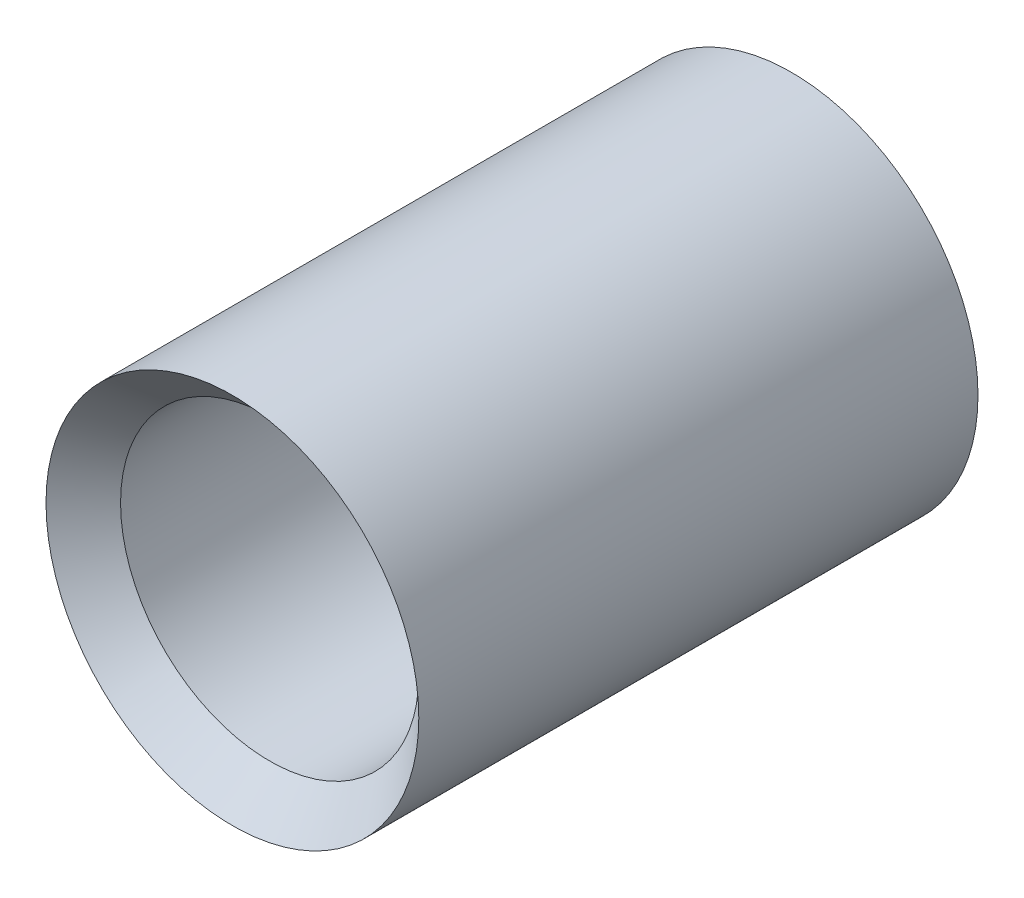
ISO-10303-21;
HEADER;
FILE_DESCRIPTION(('STEP AP214'),'2;1');
FILE_NAME('part.step','',(''),(''),'','','');
FILE_SCHEMA(('AUTOMOTIVE_DESIGN { 1 0 10303 214 1 1 1 1 }'));
ENDSEC;
DATA;
#1=APPLICATION_CONTEXT('core data for automotive mechanical design processes');
#2=APPLICATION_PROTOCOL_DEFINITION('international standard','automotive_design',2000,#1);
#3=PRODUCT_CONTEXT('',#1,'mechanical');
#4=PRODUCT('Part','Part','',(#3));
#5=PRODUCT_RELATED_PRODUCT_CATEGORY('part','',(#4));
#6=PRODUCT_DEFINITION_FORMATION('','',#4);
#7=PRODUCT_DEFINITION_CONTEXT('part definition',#1,'design');
#8=PRODUCT_DEFINITION('design','',#6,#7);
#9=PRODUCT_DEFINITION_SHAPE('','',#8);
#10=(LENGTH_UNIT() NAMED_UNIT(*) SI_UNIT(.MILLI.,.METRE.));
#11=(NAMED_UNIT(*) PLANE_ANGLE_UNIT() SI_UNIT($,.RADIAN.));
#12=(NAMED_UNIT(*) SI_UNIT($,.STERADIAN.) SOLID_ANGLE_UNIT());
#13=UNCERTAINTY_MEASURE_WITH_UNIT(LENGTH_MEASURE(1.E-05),#10,'distance_accuracy_value','');
#14=(GEOMETRIC_REPRESENTATION_CONTEXT(3) GLOBAL_UNCERTAINTY_ASSIGNED_CONTEXT((#13)) GLOBAL_UNIT_ASSIGNED_CONTEXT((#10,
#11,#12)) REPRESENTATION_CONTEXT('',''));
#15=CARTESIAN_POINT('',(0.,0.,0.));
#16=DIRECTION('',(0.,0.,1.));
#17=DIRECTION('',(1.,0.,0.));
#18=AXIS2_PLACEMENT_3D('',#15,#16,#17);
#19=CARTESIAN_POINT('',(0.,0.,7.5));
#20=DIRECTION('',(0.,0.,1.));
#21=DIRECTION('',(1.,0.,0.));
#22=AXIS2_PLACEMENT_3D('',#19,#20,#21);
#23=CYLINDRICAL_SURFACE('',#22,4.);
#24=CARTESIAN_POINT('',(0.,0.,1.0000000000332));
#25=DIRECTION('',(0.,0.,-1.));
#26=DIRECTION('',(1.,0.,0.));
#27=AXIS2_PLACEMENT_3D('',#24,#25,#26);
#28=CIRCLE('',#27,3.99999999996226);
#29=CARTESIAN_POINT('',(3.99999999996226,0.,1.0000000000332));
#30=VERTEX_POINT('',#29);
#31=EDGE_CURVE('E25',#30,#30,#28,.T.);
#32=ORIENTED_EDGE('',*,*,#31,.T.);
#33=EDGE_LOOP('',(#32));
#34=FACE_BOUND('',#33,.T.);
#35=CARTESIAN_POINT('',(0.,0.,14.00000000001));
#36=DIRECTION('',(0.,0.,1.));
#37=DIRECTION('',(1.,0.,0.));
#38=AXIS2_PLACEMENT_3D('',#35,#36,#37);
#39=CIRCLE('',#38,4.0000000000191);
#40=CARTESIAN_POINT('',(4.0000000000191,0.,14.00000000001));
#41=VERTEX_POINT('',#40);
#42=EDGE_CURVE('E16',#41,#41,#39,.T.);
#43=ORIENTED_EDGE('',*,*,#42,.T.);
#44=EDGE_LOOP('',(#43));
#45=FACE_BOUND('',#44,.T.);
#46=ADVANCED_FACE('F13',(#34,#45),#23,.F.);
#47=CARTESIAN_POINT('',(0.,0.,14.9999999999864));
#48=DIRECTION('',(0.,0.,1.));
#49=DIRECTION('',(1.,0.,0.));
#50=AXIS2_PLACEMENT_3D('',#47,#48,#49);
#51=CONICAL_SURFACE('',#50,4.99999999999545,0.785398163397448);
#52=ORIENTED_EDGE('',*,*,#42,.F.);
#53=EDGE_LOOP('',(#52));
#54=FACE_BOUND('',#53,.T.);
#55=CARTESIAN_POINT('',(0.,0.,15.));
#56=DIRECTION('',(0.,0.,1.));
#57=DIRECTION('',(1.,0.,0.));
#58=AXIS2_PLACEMENT_3D('',#55,#56,#57);
#59=CIRCLE('',#58,5.);
#60=CARTESIAN_POINT('',(5.,0.,15.));
#61=VERTEX_POINT('',#60);
#62=EDGE_CURVE('E20',#61,#61,#59,.F.);
#63=ORIENTED_EDGE('',*,*,#62,.F.);
#64=EDGE_LOOP('',(#63));
#65=FACE_BOUND('',#64,.T.);
#66=ADVANCED_FACE('F34',(#54,#65),#51,.F.);
#67=CARTESIAN_POINT('',(0.,0.,0.));
#68=DIRECTION('',(0.,0.,-1.));
#69=DIRECTION('',(-1.,0.,0.));
#70=AXIS2_PLACEMENT_3D('',#67,#68,#69);
#71=CONICAL_SURFACE('',#70,4.99999999999545,0.785398163397448);
#72=ORIENTED_EDGE('',*,*,#31,.F.);
#73=EDGE_LOOP('',(#72));
#74=FACE_BOUND('',#73,.T.);
#75=CARTESIAN_POINT('',(0.,0.,0.));
#76=DIRECTION('',(0.,0.,1.));
#77=DIRECTION('',(1.,0.,0.));
#78=AXIS2_PLACEMENT_3D('',#75,#76,#77);
#79=CIRCLE('',#78,5.);
#80=CARTESIAN_POINT('',(5.,0.,0.));
#81=VERTEX_POINT('',#80);
#82=EDGE_CURVE('E9',#81,#81,#79,.T.);
#83=ORIENTED_EDGE('',*,*,#82,.F.);
#84=EDGE_LOOP('',(#83));
#85=FACE_BOUND('',#84,.T.);
#86=ADVANCED_FACE('F37',(#74,#85),#71,.F.);
#87=CARTESIAN_POINT('',(0.,0.,7.5));
#88=DIRECTION('',(0.,0.,1.));
#89=DIRECTION('',(1.,0.,0.));
#90=AXIS2_PLACEMENT_3D('',#87,#88,#89);
#91=CYLINDRICAL_SURFACE('',#90,5.);
#92=ORIENTED_EDGE('',*,*,#62,.T.);
#93=EDGE_LOOP('',(#92));
#94=FACE_BOUND('',#93,.T.);
#95=ORIENTED_EDGE('',*,*,#82,.T.);
#96=EDGE_LOOP('',(#95));
#97=FACE_BOUND('',#96,.T.);
#98=ADVANCED_FACE('F40',(#94,#97),#91,.T.);
#99=CLOSED_SHELL('',(#46,#66,#86,#98));
#100=MANIFOLD_SOLID_BREP('B1',#99);
#101=ADVANCED_BREP_SHAPE_REPRESENTATION('',(#18,#100),#14);
#102=SHAPE_DEFINITION_REPRESENTATION(#9,#101);
ENDSEC;
END-ISO-10303-21;
